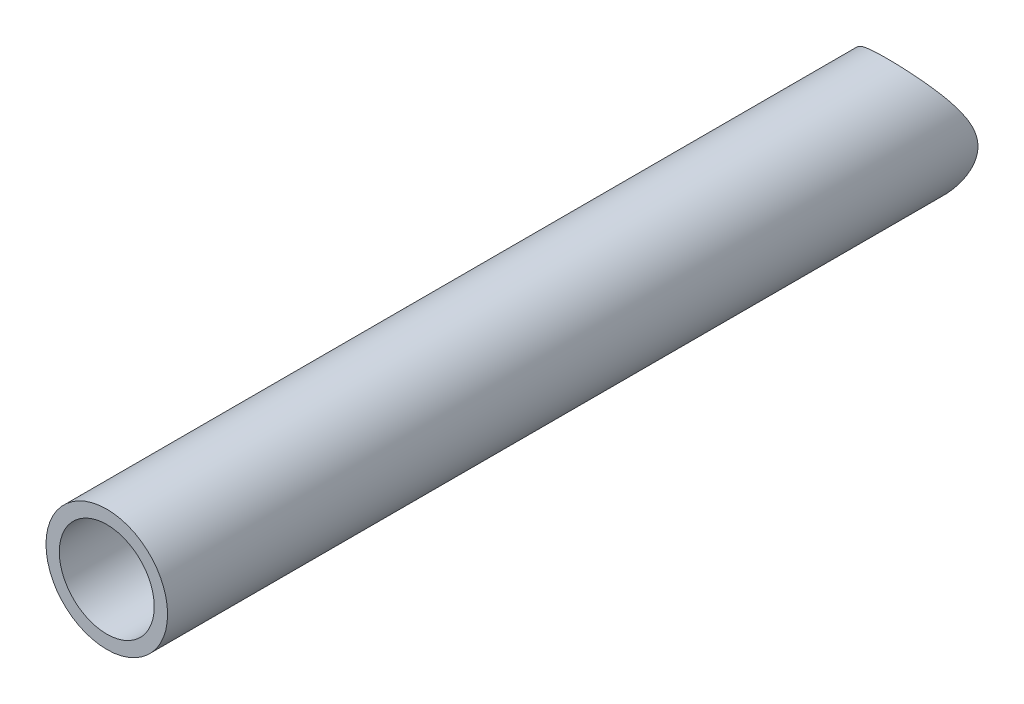
ISO-10303-21;
HEADER;
FILE_DESCRIPTION(('STEP AP214'),'2;1');
FILE_NAME('part.step','',(''),(''),'','','');
FILE_SCHEMA(('AUTOMOTIVE_DESIGN { 1 0 10303 214 1 1 1 1 }'));
ENDSEC;
DATA;
#1=APPLICATION_CONTEXT('core data for automotive mechanical design processes');
#2=APPLICATION_PROTOCOL_DEFINITION('international standard','automotive_design',2000,#1);
#3=PRODUCT_CONTEXT('',#1,'mechanical');
#4=PRODUCT('Part','Part','',(#3));
#5=PRODUCT_RELATED_PRODUCT_CATEGORY('part','',(#4));
#6=PRODUCT_DEFINITION_FORMATION('','',#4);
#7=PRODUCT_DEFINITION_CONTEXT('part definition',#1,'design');
#8=PRODUCT_DEFINITION('design','',#6,#7);
#9=PRODUCT_DEFINITION_SHAPE('','',#8);
#10=(LENGTH_UNIT() NAMED_UNIT(*) SI_UNIT(.MILLI.,.METRE.));
#11=(NAMED_UNIT(*) PLANE_ANGLE_UNIT() SI_UNIT($,.RADIAN.));
#12=(NAMED_UNIT(*) SI_UNIT($,.STERADIAN.) SOLID_ANGLE_UNIT());
#13=UNCERTAINTY_MEASURE_WITH_UNIT(LENGTH_MEASURE(1.E-05),#10,'distance_accuracy_value','');
#14=(GEOMETRIC_REPRESENTATION_CONTEXT(3) GLOBAL_UNCERTAINTY_ASSIGNED_CONTEXT((#13)) GLOBAL_UNIT_ASSIGNED_CONTEXT((#10,
#11,#12)) REPRESENTATION_CONTEXT('',''));
#15=CARTESIAN_POINT('',(0.,0.,0.));
#16=DIRECTION('',(0.,0.,1.));
#17=DIRECTION('',(1.,0.,0.));
#18=AXIS2_PLACEMENT_3D('',#15,#16,#17);
#19=CARTESIAN_POINT('',(0.,0.,177.8));
#20=DIRECTION('',(0.,0.,1.));
#21=DIRECTION('',(1.,0.,0.));
#22=AXIS2_PLACEMENT_3D('',#19,#20,#21);
#23=PLANE('',#22);
#24=CARTESIAN_POINT('',(0.,0.,177.8));
#25=DIRECTION('',(0.,0.,1.));
#26=DIRECTION('',(1.,0.,0.));
#27=AXIS2_PLACEMENT_3D('',#24,#25,#26);
#28=CIRCLE('',#27,13.335);
#29=CARTESIAN_POINT('',(13.335,0.,177.8));
#30=VERTEX_POINT('',#29);
#31=EDGE_CURVE('E10',#30,#30,#28,.T.);
#32=ORIENTED_EDGE('',*,*,#31,.T.);
#33=EDGE_LOOP('',(#32));
#34=FACE_BOUND('',#33,.T.);
#35=CARTESIAN_POINT('',(0.,0.,177.8));
#36=DIRECTION('',(0.,0.,1.));
#37=DIRECTION('',(1.,0.,0.));
#38=AXIS2_PLACEMENT_3D('',#35,#36,#37);
#39=CIRCLE('',#38,10.414);
#40=CARTESIAN_POINT('',(10.414,0.,177.8));
#41=VERTEX_POINT('',#40);
#42=EDGE_CURVE('E43',#41,#41,#39,.T.);
#43=ORIENTED_EDGE('',*,*,#42,.F.);
#44=EDGE_LOOP('',(#43));
#45=FACE_BOUND('',#44,.T.);
#46=ADVANCED_FACE('F30',(#34,#45),#23,.T.);
#47=CARTESIAN_POINT('',(0.,0.,177.8));
#48=DIRECTION('',(0.,0.,-1.));
#49=DIRECTION('',(-1.,0.,0.));
#50=AXIS2_PLACEMENT_3D('',#47,#48,#49);
#51=CYLINDRICAL_SURFACE('',#50,13.335);
#52=ORIENTED_EDGE('',*,*,#31,.F.);
#53=EDGE_LOOP('',(#52));
#54=FACE_BOUND('',#53,.T.);
#55=CARTESIAN_POINT('',(-13.335,0.,0.));
#56=CARTESIAN_POINT('',(-13.3350018835583,-0.25260066554457,-4.41804586379893E-06));
#57=CARTESIAN_POINT('',(-13.3278081915065,-0.505180181138942,0.00946030255961878));
#58=CARTESIAN_POINT('',(-13.2992229696508,-1.0081312686111,0.0468173328208232));
#59=CARTESIAN_POINT('',(-13.2778324639304,-1.25850299842705,0.0747083133022277));
#60=CARTESIAN_POINT('',(-13.221298692822,-1.7556217914152,0.147639503982388));
#61=CARTESIAN_POINT('',(-13.1861289902354,-2.00236093508548,0.19271267595338));
#62=CARTESIAN_POINT('',(-13.1027363122342,-2.49035106736416,0.29806384539933));
#63=CARTESIAN_POINT('',(-13.0545089948928,-2.73160020145244,0.358346900019491));
#64=CARTESIAN_POINT('',(-12.9270679911359,-3.28949608225185,0.514873605096694));
#65=CARTESIAN_POINT('',(-12.8429017011591,-3.60354441668755,0.616354851587238));
#66=CARTESIAN_POINT('',(-12.6541392757462,-4.21884661840762,0.837409574619791));
#67=CARTESIAN_POINT('',(-12.5495350638498,-4.52009537019378,0.956990199275824));
#68=CARTESIAN_POINT('',(-12.3210588362959,-5.11019328667382,1.20971117557399));
#69=CARTESIAN_POINT('',(-12.1971412271413,-5.39901099162804,1.342883349452));
#70=CARTESIAN_POINT('',(-11.9312789951177,-5.96356959471666,1.61844049966321));
#71=CARTESIAN_POINT('',(-11.7893345617438,-6.23931063026906,1.76082537914623));
#72=CARTESIAN_POINT('',(-11.4351207725684,-6.87272159117594,2.10250790305589));
#73=CARTESIAN_POINT('',(-11.2156753742223,-7.22509978127038,2.30421018645036));
#74=CARTESIAN_POINT('',(-10.7460969667935,-7.90663692246017,2.71129416339928));
#75=CARTESIAN_POINT('',(-10.4959533036399,-8.23578774954224,2.91667711311893));
#76=CARTESIAN_POINT('',(-9.96572044979838,-8.87002434324639,3.32515689427277));
#77=CARTESIAN_POINT('',(-9.68565507714535,-9.17512891968713,3.52825540388115));
#78=CARTESIAN_POINT('',(-9.09577027280359,-9.76020740897136,3.92714798984174));
#79=CARTESIAN_POINT('',(-8.78596061093941,-10.040189515495,4.12294443549393));
#80=CARTESIAN_POINT('',(-8.20039149380346,-10.520926265363,4.46532056306));
#81=CARTESIAN_POINT('',(-7.92980709197362,-10.72647206204,4.6140415996008));
#82=CARTESIAN_POINT('',(-7.37001371027608,-11.1185361419878,4.90112213816946));
#83=CARTESIAN_POINT('',(-7.08080832046564,-11.3050580751761,5.03948362642021));
#84=CARTESIAN_POINT('',(-6.48476961243444,-11.6571716843423,5.30318479537009));
#85=CARTESIAN_POINT('',(-6.17795764056499,-11.8227879579729,5.42853974807019));
#86=CARTESIAN_POINT('',(-5.54749851430927,-12.1313886711944,5.66388132694842));
#87=CARTESIAN_POINT('',(-5.22385412946151,-12.2743768183737,5.77387047044705));
#88=CARTESIAN_POINT('',(-4.61445090959261,-12.5147316414834,5.95982470157496));
#89=CARTESIAN_POINT('',(-4.33092557923486,-12.6157372327183,6.03841773704634));
#90=CARTESIAN_POINT('',(-3.75450020312213,-12.7991164936384,6.18164972083977));
#91=CARTESIAN_POINT('',(-3.46160194088284,-12.8814936842211,6.24629130597758));
#92=CARTESIAN_POINT('',(-2.8681404682298,-13.0264831008333,6.36038008423909));
#93=CARTESIAN_POINT('',(-2.56757984496393,-13.0891019050808,6.40983233424702));
#94=CARTESIAN_POINT('',(-1.96066623508877,-13.1936659750032,6.49255852086304));
#95=CARTESIAN_POINT('',(-1.65431317902439,-13.2356109926223,6.52583226335217));
#96=CARTESIAN_POINT('',(-1.03701109149953,-13.2982480320635,6.57556317857216));
#97=CARTESIAN_POINT('',(-0.726049933065985,-13.3188669472207,6.59196250419741));
#98=CARTESIAN_POINT('',(-0.103012729995218,-13.3382438320951,6.60737317878809));
#99=CARTESIAN_POINT('',(0.20906331675464,-13.3370017603655,6.60638449478701));
#100=CARTESIAN_POINT('',(0.831829713082657,-13.3126781946912,6.58704165766493));
#101=CARTESIAN_POINT('',(1.14252000409395,-13.2895957863225,6.56868677744582));
#102=CARTESIAN_POINT('',(1.76006249178827,-13.2219849823655,6.51502345446557));
#103=CARTESIAN_POINT('',(2.06691477164878,-13.1774570523742,6.47971537976998));
#104=CARTESIAN_POINT('',(2.65841816324259,-13.0705979998941,6.39521902122709));
#105=CARTESIAN_POINT('',(2.94338375434867,-13.00933603674,6.34686596880888));
#106=CARTESIAN_POINT('',(3.50619215178327,-12.8690694518321,6.2365415220651));
#107=CARTESIAN_POINT('',(3.78403526873392,-12.790065605301,6.17457072276271));
#108=CARTESIAN_POINT('',(4.33119902282741,-12.6152856498986,6.03807517426191));
#109=CARTESIAN_POINT('',(4.60051988272296,-12.5195099798334,5.96355075350951));
#110=CARTESIAN_POINT('',(5.1296149373469,-12.3121910574254,5.80309969459564));
#111=CARTESIAN_POINT('',(5.38938559652075,-12.2006420382811,5.71716888691923));
#112=CARTESIAN_POINT('',(5.92314694256134,-11.9512989152239,5.52632735738705));
#113=CARTESIAN_POINT('',(6.19606858852893,-11.8120080699776,5.42038383999724));
#114=CARTESIAN_POINT('',(6.72852987068944,-11.5170222291997,5.19793817635211));
#115=CARTESIAN_POINT('',(6.98806390677509,-11.3613204504507,5.08143166684332));
#116=CARTESIAN_POINT('',(7.49313237236962,-11.0347473814483,4.83956293860301));
#117=CARTESIAN_POINT('',(7.73866414659993,-10.8638732296312,4.71419905025285));
#118=CARTESIAN_POINT('',(8.21534781549371,-10.5080336183393,4.45630653732362));
#119=CARTESIAN_POINT('',(8.44649777709958,-10.323066272001,4.32377695405953));
#120=CARTESIAN_POINT('',(8.94021319861167,-9.90055490386111,4.02542206890903));
#121=CARTESIAN_POINT('',(9.19947085220181,-9.66001839293889,3.85835197711781));
#122=CARTESIAN_POINT('',(9.69655392584509,-9.16095787290498,3.51921059201487));
#123=CARTESIAN_POINT('',(9.93437574758541,-8.90243085668733,3.3471384654273));
#124=CARTESIAN_POINT('',(10.3886301428753,-8.36790011144193,3.00094897274981));
#125=CARTESIAN_POINT('',(10.6050386411018,-8.09187727076411,2.82682954540126));
#126=CARTESIAN_POINT('',(11.0158726269487,-7.52302253492355,2.48019420728758));
#127=CARTESIAN_POINT('',(11.2103009334064,-7.23019280242983,2.30767809351672));
#128=CARTESIAN_POINT('',(11.5568219625657,-6.66039677944759,1.98662223375441));
#129=CARTESIAN_POINT('',(11.711219227524,-6.38515354902388,1.83751110216693));
#130=CARTESIAN_POINT('',(12.0015773776697,-5.82108162671999,1.54703115296451));
#131=CARTESIAN_POINT('',(12.1375364225574,-5.53225158262329,1.4056631090173));
#132=CARTESIAN_POINT('',(12.3898436719785,-4.94135935041646,1.13493601954768));
#133=CARTESIAN_POINT('',(12.5062253613423,-4.63932089232399,1.00555664263072));
#134=CARTESIAN_POINT('',(12.7182990683145,-4.02164137432731,0.763361027408029));
#135=CARTESIAN_POINT('',(12.8140000744825,-3.70600629582986,0.650537600169346));
#136=CARTESIAN_POINT('',(12.9583480552744,-3.15580069992221,0.476663121517532));
#137=CARTESIAN_POINT('',(13.012578702554,-2.92442771123945,0.410108320642635));
#138=CARTESIAN_POINT('',(13.1090843688346,-2.45587138888756,0.29017335867426));
#139=CARTESIAN_POINT('',(13.1513631892406,-2.2186899288039,0.236789009268395));
#140=CARTESIAN_POINT('',(13.2232141598878,-1.73991713503723,0.145244287195908));
#141=CARTESIAN_POINT('',(13.252808545442,-1.49833429848433,0.107057282656748));
#142=CARTESIAN_POINT('',(13.2988000197528,-1.01184151245427,0.0474115283567748));
#143=CARTESIAN_POINT('',(13.3151973674002,-0.766931628340788,0.0259524504387124));
#144=CARTESIAN_POINT('',(13.3344677036844,-0.274343177246851,0.000711560174502452));
#145=CARTESIAN_POINT('',(13.3372680199915,-0.0266568094237172,-0.00297526368958773));
#146=CARTESIAN_POINT('',(13.3290786147271,0.468083085198075,0.00776978841826561));
#147=CARTESIAN_POINT('',(13.3180890659849,0.715136619889184,0.0222014373102772));
#148=CARTESIAN_POINT('',(13.282562242767,1.20690658021464,0.0685050160871282));
#149=CARTESIAN_POINT('',(13.2580082663322,1.45161974547984,0.100398446332441));
#150=CARTESIAN_POINT('',(13.1958756748349,1.9367315407125,0.180189296193889));
#151=CARTESIAN_POINT('',(13.1582950654663,2.17712950411564,0.228089166267897));
#152=CARTESIAN_POINT('',(13.0591373744708,2.71564739922316,0.352622006032737));
#153=CARTESIAN_POINT('',(12.9938354987734,3.01209796460511,0.433509414504391));
#154=CARTESIAN_POINT('',(12.8449013345005,3.59460915157597,0.613621970225148));
#155=CARTESIAN_POINT('',(12.7612631741685,3.88066641067301,0.71285298997702));
#156=CARTESIAN_POINT('',(12.5767550227727,4.44241801714673,0.925774852731412));
#157=CARTESIAN_POINT('',(12.4758438543641,4.71808563465355,1.03950007923341));
#158=CARTESIAN_POINT('',(12.2579879680555,5.25820943829558,1.27755406497322));
#159=CARTESIAN_POINT('',(12.1410425865128,5.52266515978627,1.40188326302007));
#160=CARTESIAN_POINT('',(11.8371583681547,6.15426722584639,1.71426733541413));
#161=CARTESIAN_POINT('',(11.6420342936373,6.51551250633955,1.90633129338224));
#162=CARTESIAN_POINT('',(11.2216175238868,7.21555903342094,2.29831092727666));
#163=CARTESIAN_POINT('',(10.9963130172986,7.55435141489833,2.49822965547306));
#164=CARTESIAN_POINT('',(10.5161025857764,8.20968598018093,2.899943197658));
#165=CARTESIAN_POINT('',(10.2611691765466,8.52620706078353,3.10173959121546));
#166=CARTESIAN_POINT('',(9.7222955130326,9.13590037329923,3.50173354755338));
#167=CARTESIAN_POINT('',(9.43835963850486,9.42907611880254,3.69993164841534));
#168=CARTESIAN_POINT('',(8.83810553010333,9.99409933574634,4.09033115020463));
#169=CARTESIAN_POINT('',(8.52143787305497,10.2656467378906,4.28243132467427));
#170=CARTESIAN_POINT('',(7.85900952004657,10.7812020330972,4.65334785506308));
#171=CARTESIAN_POINT('',(7.51324438693058,11.0252057126083,4.83216217712854));
#172=CARTESIAN_POINT('',(6.79461941113272,11.4819916908848,5.17122972886973));
#173=CARTESIAN_POINT('',(6.42183720734669,11.6948585322159,5.33153296048587));
#174=CARTESIAN_POINT('',(5.65023186357861,12.0865217604438,5.62931182776178));
#175=CARTESIAN_POINT('',(5.25142377307236,12.2653376070083,5.76680049581335));
#176=CARTESIAN_POINT('',(4.56361981988235,12.5333321327887,5.97427554007837));
#177=CARTESIAN_POINT('',(4.28082741167634,12.6327964408013,6.0517116325857));
#178=CARTESIAN_POINT('',(3.70604602932891,12.8132003498665,6.19268656788534));
#179=CARTESIAN_POINT('',(3.41405946034836,12.8941447506088,6.25622901121905));
#180=CARTESIAN_POINT('',(2.82265090056091,13.0363844364874,6.3681912754996));
#181=CARTESIAN_POINT('',(2.52323293693166,13.0976901239936,6.41661910211107));
#182=CARTESIAN_POINT('',(1.91875291464487,13.1997938182709,6.49741564174296));
#183=CARTESIAN_POINT('',(1.61369064863518,13.2405910700757,6.52978376356547));
#184=CARTESIAN_POINT('',(0.999118934738675,13.3011143598618,6.57784171979375));
#185=CARTESIAN_POINT('',(0.689597930404728,13.3207686203741,6.5934747400228));
#186=CARTESIAN_POINT('',(0.0695466855144508,13.3384249055402,6.60751740280568));
#187=CARTESIAN_POINT('',(-0.240983550759719,13.3364270219441,6.60592711834266));
#188=CARTESIAN_POINT('',(-0.860608230919038,13.3108129018294,6.5855586762831));
#189=CARTESIAN_POINT('',(-1.16970253629438,13.2871946216086,6.56677889382204));
#190=CARTESIAN_POINT('',(-1.7840271077989,13.2187364352257,6.5124472851639));
#191=CARTESIAN_POINT('',(-2.08925744028245,13.1738968939962,6.47689574738329));
#192=CARTESIAN_POINT('',(-2.67904189008748,13.0663858685518,6.39189296811723));
#193=CARTESIAN_POINT('',(-2.96388256264536,13.0046803663957,6.34319609327019));
#194=CARTESIAN_POINT('',(-3.52640331101175,12.8635451096217,6.23220507066962));
#195=CARTESIAN_POINT('',(-3.80408367326884,12.7841160652659,6.16991146780043));
#196=CARTESIAN_POINT('',(-4.35089076211127,12.6085067209682,6.03279501658021));
#197=CARTESIAN_POINT('',(-4.62001768351707,12.5123268028823,5.95797245384311));
#198=CARTESIAN_POINT('',(-5.14869868236347,12.3042217198989,5.79695239296523));
#199=CARTESIAN_POINT('',(-5.40824921556641,12.192290797864,5.71075073637734));
#200=CARTESIAN_POINT('',(-5.94175442813972,11.9420638650091,5.51929005874799));
#201=CARTESIAN_POINT('',(-6.21462772166141,11.8022590274366,5.41299128076769));
#202=CARTESIAN_POINT('',(-6.74695181375943,11.506244913808,5.18985498746836));
#203=CARTESIAN_POINT('',(-7.0063969932695,11.3500288519171,5.07301311555204));
#204=CARTESIAN_POINT('',(-7.51130379608293,11.0223930959822,4.83047292757707));
#205=CARTESIAN_POINT('',(-7.75675983457645,10.8509673987442,4.70477111859027));
#206=CARTESIAN_POINT('',(-8.23316407807805,10.4940843291692,4.44627719970785));
#207=CARTESIAN_POINT('',(-8.46411572507522,10.3086303090509,4.31348678592874));
#208=CARTESIAN_POINT('',(-8.95751360458415,9.88491893846115,4.01450568628332));
#209=CARTESIAN_POINT('',(-9.2166344407091,9.64365871090713,3.84707386405982));
#210=CARTESIAN_POINT('',(-9.71338359433793,9.1431269962013,3.50726566085311));
#211=CARTESIAN_POINT('',(-9.95100833717147,8.8838525260181,3.33488846373858));
#212=CARTESIAN_POINT('',(-10.4047731239597,8.34783518111774,2.98818826749895));
#213=CARTESIAN_POINT('',(-10.6208922881973,8.0710757482913,2.81386355666099));
#214=CARTESIAN_POINT('',(-11.0310894425851,7.50071243200201,2.46691288223526));
#215=CARTESIAN_POINT('',(-11.2251700784236,7.20711057682673,2.29428671701727));
#216=CARTESIAN_POINT('',(-11.5701538277917,6.6371554354444,1.9738984726655));
#217=CARTESIAN_POINT('',(-11.7234578570591,6.36259678810151,1.82552949638663));
#218=CARTESIAN_POINT('',(-12.0117396857837,5.80002207497551,1.5365813204646));
#219=CARTESIAN_POINT('',(-12.1467165367624,5.51200531373641,1.39600252420598));
#220=CARTESIAN_POINT('',(-12.3973007546463,4.92255818333212,1.12673210327336));
#221=CARTESIAN_POINT('',(-12.5129267955052,4.62114110554173,0.998029072682754));
#222=CARTESIAN_POINT('',(-12.6708961648661,4.15897860022359,0.817428352816471));
#223=CARTESIAN_POINT('',(-12.720970424832,4.00326647621674,0.759308548188348));
#224=CARTESIAN_POINT('',(-12.8157902265065,3.68846645240004,0.64785471245141));
#225=CARTESIAN_POINT('',(-12.8605337488949,3.52937730006469,0.594522496788288));
#226=CARTESIAN_POINT('',(-12.9723189437138,3.10121593117371,0.459767701675861));
#227=CARTESIAN_POINT('',(-13.0344342958884,2.82927051577926,0.383212897052135));
#228=CARTESIAN_POINT('',(-13.1420471176317,2.2776581941,0.248759025540197));
#229=CARTESIAN_POINT('',(-13.1875516194773,1.99799460939796,0.190852065230886));
#230=CARTESIAN_POINT('',(-13.2607666824456,1.43352982580562,0.0968812511782515));
#231=CARTESIAN_POINT('',(-13.2885301289126,1.14874652291903,0.0607524959376859));
#232=CARTESIAN_POINT('',(-13.3256440457461,0.575965922965784,0.012316547011447));
#233=CARTESIAN_POINT('',(-13.3349978527103,0.287969217819625,5.03665027543216E-06));
#234=CARTESIAN_POINT('',(-13.335,0.,0.));
#235=B_SPLINE_CURVE_WITH_KNOTS('',3,(#55,#56,#57,#58,#59,#60,#61,#62,#63,#64,#65,#66,#67,#68,
#69,#70,#71,#72,#73,#74,#75,#76,#77,#78,#79,#80,#81,#82,#83,#84,#85,#86,#87,#88,#89,#90,#91,#92,
#93,#94,#95,#96,#97,#98,#99,#100,#101,#102,#103,#104,#105,#106,#107,#108,#109,#110,#111,#112,
#113,#114,#115,#116,#117,#118,#119,#120,#121,#122,#123,#124,#125,#126,#127,#128,#129,#130,#131,
#132,#133,#134,#135,#136,#137,#138,#139,#140,#141,#142,#143,#144,#145,#146,#147,#148,#149,#150,
#151,#152,#153,#154,#155,#156,#157,#158,#159,#160,#161,#162,#163,#164,#165,#166,#167,#168,#169,
#170,#171,#172,#173,#174,#175,#176,#177,#178,#179,#180,#181,#182,#183,#184,#185,#186,#187,#188,
#189,#190,#191,#192,#193,#194,#195,#196,#197,#198,#199,#200,#201,#202,#203,#204,#205,#206,#207,
#208,#209,#210,#211,#212,#213,#214,#215,#216,#217,#218,#219,#220,#221,#222,#223,#224,#225,#226,
#227,#228,#229,#230,#231,#232,#233,#234),.UNSPECIFIED.,.T.,.F.,(4,2,2,2,2,2,2,2,2,2,2,2,2,2,2,2,
2,2,2,2,2,2,2,2,2,2,2,2,2,2,2,2,2,2,2,2,2,2,2,2,2,2,2,2,2,2,2,2,2,2,2,2,2,2,2,2,2,2,2,2,2,2,2,2,
2,2,2,2,2,2,2,2,2,2,2,2,2,2,2,2,2,2,2,2,2,2,2,2,2,4),(0.,0.757492603462582,1.51493057132342,
2.27382895662258,3.03298000189446,4.05316777887395,5.07375952216547,6.09679814521146,
7.11982601513092,8.50264292621323,9.885941119088,11.2681462805546,12.6498989853766,
13.7616640148444,14.8732153382742,15.9834463691097,17.0934953013038,18.0257692725457,
18.9578668899685,19.8896538531386,20.8214519961445,21.7564338958387,22.6914175681967,
23.6264403887329,24.5614429101957,25.4468690785033,26.3322565660819,27.2176208924678,
28.1033097526712,29.0750132113793,30.0471198962682,31.0194103149822,31.991831138059,
33.1641176298033,34.336600541633,35.5103870619888,36.6840228795758,37.7303936076991,
38.776868696255,39.8215352970923,40.865746931387,41.605493547816,42.3450046145968,
43.0832139925408,43.8214088884236,44.5635449191221,45.3056716486769,46.0487142065181,
46.7918705703841,47.7328527048514,48.6741366076111,49.6176965229466,50.5612955032405,
51.9192515459655,53.2777405969196,54.637500018396,55.9970544009157,57.3730150509172,
58.7491859065692,60.1215479222455,61.4931232828782,62.4210722567217,63.3487804666688,
64.2759964660231,65.2032465959866,66.1336347703177,67.0640190021624,67.9944911891327,
68.9249473757657,69.810458603537,70.6959343512543,71.5813899161473,72.4671699679362,
73.4397629947177,74.4127597712546,75.386142309596,76.3592929780608,77.533105424131,
78.7071127106593,79.8822489389209,81.0572439445793,82.0995908142991,83.1419916076063,
84.1833805872736,84.7039788284557,85.2247736530082,86.0914471044991,86.9577532192615,
87.8214647141655,88.6850196539476),.UNSPECIFIED.);
#236=CARTESIAN_POINT('',(-13.335,0.,0.));
#237=VERTEX_POINT('',#236);
#238=EDGE_CURVE('E47',#237,#237,#235,.T.);
#239=ORIENTED_EDGE('',*,*,#238,.T.);
#240=EDGE_LOOP('',(#239));
#241=FACE_BOUND('',#240,.T.);
#242=ADVANCED_FACE('F32',(#54,#241),#51,.T.);
#243=CARTESIAN_POINT('',(0.,0.,177.8));
#244=DIRECTION('',(0.,0.,-1.));
#245=DIRECTION('',(-1.,0.,0.));
#246=AXIS2_PLACEMENT_3D('',#243,#244,#245);
#247=CYLINDRICAL_SURFACE('',#246,10.414);
#248=CARTESIAN_POINT('',(-10.414,0.,2.97777593064981));
#249=CARTESIAN_POINT('',(-10.4139971977502,-0.259320293602472,2.9777803668923));
#250=CARTESIAN_POINT('',(-10.4042945538137,-0.51869902090619,2.98548779044861));
#251=CARTESIAN_POINT('',(-10.3656562718614,-1.03524009341079,3.01597679964009));
#252=CARTESIAN_POINT('',(-10.3367088612837,-1.29240098429833,3.03876761216765));
#253=CARTESIAN_POINT('',(-10.260024735684,-1.80278066142993,3.09846866802453));
#254=CARTESIAN_POINT('',(-10.2122489044345,-2.0559900926193,3.13540830114828));
#255=CARTESIAN_POINT('',(-10.0986605107374,-2.5562265947107,3.22189373605026));
#256=CARTESIAN_POINT('',(-10.0328389857492,-2.80325052682713,3.27144580101731));
#257=CARTESIAN_POINT('',(-9.8847359146255,-3.28738159226009,3.38081092660631));
#258=CARTESIAN_POINT('',(-9.80261014376922,-3.52455867743518,3.44052616838954));
#259=CARTESIAN_POINT('',(-9.62240226983704,-3.99039154173782,3.56862397722607));
#260=CARTESIAN_POINT('',(-9.52431284944504,-4.21904335374996,3.63701051578294));
#261=CARTESIAN_POINT('',(-9.20738904817267,-4.89083655452697,3.85224108364626));
#262=CARTESIAN_POINT('',(-8.96575135909287,-5.32029169454097,4.00927032877828));
#263=CARTESIAN_POINT('',(-8.54444360879435,-5.95992815410918,4.26494294173709));
#264=CARTESIAN_POINT('',(-8.38331597477739,-6.18446434176115,4.35938925070721));
#265=CARTESIAN_POINT('',(-8.04407691078616,-6.61968916255632,4.55005397967297));
#266=CARTESIAN_POINT('',(-7.86596288317263,-6.83037566939231,4.64627266888823));
#267=CARTESIAN_POINT('',(-7.49330876126374,-7.23725947910777,4.83832746942558));
#268=CARTESIAN_POINT('',(-7.29875310803802,-7.43344272072321,4.93416312641745));
#269=CARTESIAN_POINT('',(-6.89406041312966,-7.81023230757363,5.12325081709631));
#270=CARTESIAN_POINT('',(-6.68392853691619,-7.99084377420345,5.21650369333136));
#271=CARTESIAN_POINT('',(-6.22275249029921,-8.35615166972902,5.40931036463223));
#272=CARTESIAN_POINT('',(-5.96981644115937,-8.53877227472691,5.50829165987568));
#273=CARTESIAN_POINT('',(-5.44630261631851,-8.88184222832684,5.69787376870146));
#274=CARTESIAN_POINT('',(-5.17572308548167,-9.04228936619227,5.7884737463533));
#275=CARTESIAN_POINT('',(-4.61861189959138,-9.33913022885647,5.95863714321561));
#276=CARTESIAN_POINT('',(-4.33209228020508,-9.47554178607931,6.03820873514754));
#277=CARTESIAN_POINT('',(-3.74487915977016,-9.72258615327123,6.18395836041019));
#278=CARTESIAN_POINT('',(-3.44418820912209,-9.83322358064619,6.25013879247226));
#279=CARTESIAN_POINT('',(-2.86200239050502,-10.0171816692424,6.36106652563247));
#280=CARTESIAN_POINT('',(-2.58162283487851,-10.0931379217884,6.40730088505703));
#281=CARTESIAN_POINT('',(-2.01362335144057,-10.2216177127417,6.48588851263788));
#282=CARTESIAN_POINT('',(-1.72600386656626,-10.2741426810062,6.51824262780958));
#283=CARTESIAN_POINT('',(-1.14634228435869,-10.3548469124762,6.56808129969772));
#284=CARTESIAN_POINT('',(-0.85430421821056,-10.3830471481908,6.58557866553131));
#285=CARTESIAN_POINT('',(-0.26838673135028,-10.4146726556277,6.60520687315526));
#286=CARTESIAN_POINT('',(0.0254924775728095,-10.4181007263917,6.60733945103438));
#287=CARTESIAN_POINT('',(0.573180741696013,-10.4013296747898,6.59692515477913));
#288=CARTESIAN_POINT('',(0.827127734053408,-10.3842081291406,6.58629031477561));
#289=CARTESIAN_POINT('',(1.33234400132038,-10.3315410928264,6.5536813359588));
#290=CARTESIAN_POINT('',(1.58361357008771,-10.295997645743,6.53170845490028));
#291=CARTESIAN_POINT('',(2.08174410072439,-10.2069469513966,6.4769242380585));
#292=CARTESIAN_POINT('',(2.3286048874304,-10.1534389920584,6.44411247264566));
#293=CARTESIAN_POINT('',(2.81633671800717,-10.0291069295344,6.36837244934931));
#294=CARTESIAN_POINT('',(3.05720750992504,-9.95828209931407,6.32544376671812));
#295=CARTESIAN_POINT('',(3.53223394396005,-9.79987686986047,6.23023763570334));
#296=CARTESIAN_POINT('',(3.76636891025412,-9.71225014077949,6.1779343643066));
#297=CARTESIAN_POINT('',(4.22613044874113,-9.52119827621875,6.06508341829123));
#298=CARTESIAN_POINT('',(4.45175396897102,-9.41776753976283,6.00453282163117));
#299=CARTESIAN_POINT('',(4.89339785099951,-9.19603705440096,5.87635475591259));
#300=CARTESIAN_POINT('',(5.10942034608744,-9.07774063114501,5.80872887025423));
#301=CARTESIAN_POINT('',(5.53121272805852,-8.82707748564328,5.6675707017009));
#302=CARTESIAN_POINT('',(5.73697890568146,-8.69470572642178,5.59403630671263));
#303=CARTESIAN_POINT('',(6.16231924893595,-8.39953876766275,5.43295260313469));
#304=CARTESIAN_POINT('',(6.38045785527995,-8.23500539125246,5.34479429230737));
#305=CARTESIAN_POINT('',(6.80218061979963,-7.89024272583301,5.1644566070092));
#306=CARTESIAN_POINT('',(7.00576371058284,-7.71001228786425,5.07227693843857));
#307=CARTESIAN_POINT('',(7.39800569628902,-7.33448873435175,4.88567452267107));
#308=CARTESIAN_POINT('',(7.58664400401544,-7.13917554814316,4.79124890648963));
#309=CARTESIAN_POINT('',(7.94808482183726,-6.73446075630917,4.60227202089178));
#310=CARTESIAN_POINT('',(8.12088664069449,-6.52505853641047,4.50772074617314));
#311=CARTESIAN_POINT('',(8.47117003607218,-6.06503510054474,4.30857167898344));
#312=CARTESIAN_POINT('',(8.64639955182706,-5.81257496529841,4.2042441857937));
#313=CARTESIAN_POINT('',(8.97481240416957,-5.29140959896376,4.00136260944723));
#314=CARTESIAN_POINT('',(9.1279916771673,-5.02270138647747,3.90280959243507));
#315=CARTESIAN_POINT('',(9.41074314872855,-4.47050119638304,3.7151717078068));
#316=CARTESIAN_POINT('',(9.54035053145641,-4.18703207863767,3.6260728128713));
#317=CARTESIAN_POINT('',(9.77463853439706,-3.60634853960709,3.4609518258683));
#318=CARTESIAN_POINT('',(9.87932967400567,-3.30913998249792,3.38492421900691));
#319=CARTESIAN_POINT('',(10.0382478767089,-2.7820410123251,3.2673469032732));
#320=CARTESIAN_POINT('',(10.0985152628602,-2.55480848868063,3.2219764616516));
#321=CARTESIAN_POINT('',(10.2038162510079,-2.09502152073701,3.14185461773527));
#322=CARTESIAN_POINT('',(10.2488535003903,-1.86246836491193,3.10710067314404));
#323=CARTESIAN_POINT('',(10.3230524859214,-1.39364406639401,3.04944615367134));
#324=CARTESIAN_POINT('',(10.3522316870791,-1.15737731001042,3.02653254000399));
#325=CARTESIAN_POINT('',(10.3943447467208,-0.68250047841751,2.99336078186224));
#326=CARTESIAN_POINT('',(10.4072783330498,-0.443890364018498,2.98310284940253));
#327=CARTESIAN_POINT('',(10.4166953754005,0.0343744934949076,2.97564024739009));
#328=CARTESIAN_POINT('',(10.4131434260518,0.274030379560336,2.9784636721579));
#329=CARTESIAN_POINT('',(10.3895682601491,0.752015672463478,2.99711503847896));
#330=CARTESIAN_POINT('',(10.369544949742,0.990345071735152,3.01294305413168));
#331=CARTESIAN_POINT('',(10.3133308867632,1.46408585433058,3.05700237873899));
#332=CARTESIAN_POINT('',(10.2771286970399,1.69949505210409,3.08524246178182));
#333=CARTESIAN_POINT('',(10.189085958223,2.16568821461459,3.15309267390486));
#334=CARTESIAN_POINT('',(10.1372450132863,2.39647206211849,3.19270309078612));
#335=CARTESIAN_POINT('',(10.0194377882424,2.84888145409226,3.28132601508104));
#336=CARTESIAN_POINT('',(9.95368440389312,3.07059081879295,3.33019576847848));
#337=CARTESIAN_POINT('',(9.80828404873303,3.50741700181085,3.43628401927867));
#338=CARTESIAN_POINT('',(9.72863252694356,3.72253163345523,3.49350525038607));
#339=CARTESIAN_POINT('',(9.55611189038958,4.14539164773381,3.61481045695557));
#340=CARTESIAN_POINT('',(9.46324214535521,4.35313667838109,3.67889475962581));
#341=CARTESIAN_POINT('',(9.26490163544422,4.76071072688401,3.81246472751376));
#342=CARTESIAN_POINT('',(9.15943030607957,4.9605393895916,3.88195063464763));
#343=CARTESIAN_POINT('',(8.91533635146816,5.38886675075726,4.03844387740767));
#344=CARTESIAN_POINT('',(8.77421617193913,5.61564252564724,4.12628000732022));
#345=CARTESIAN_POINT('',(8.47570350279014,6.05679746000362,4.30538677574593));
#346=CARTESIAN_POINT('',(8.31830913300622,6.27117518264664,4.39665781031858));
#347=CARTESIAN_POINT('',(7.98776657594202,6.68712250733902,4.58064068344264));
#348=CARTESIAN_POINT('',(7.81460409156648,6.88868019841784,4.67335376507873));
#349=CARTESIAN_POINT('',(7.45323767712683,7.27813284217124,4.85818843221776));
#350=CARTESIAN_POINT('',(7.26503282585573,7.46602695672928,4.95030998112095));
#351=CARTESIAN_POINT('',(6.84367018738068,7.85558525050047,5.14628054205958));
#352=CARTESIAN_POINT('',(6.60807736345221,8.05483323229106,5.24972030235172));
#353=CARTESIAN_POINT('',(6.11851929907131,8.43271726472761,5.45057969894014));
#354=CARTESIAN_POINT('',(5.86455533713263,8.61135474749154,5.54799975329621));
#355=CARTESIAN_POINT('',(5.33944167700222,8.94643654070129,5.73417696331794));
#356=CARTESIAN_POINT('',(5.06829606132266,9.10288609479853,5.82293616424248));
#357=CARTESIAN_POINT('',(4.51028290166067,9.39188097750883,5.98928489696684));
#358=CARTESIAN_POINT('',(4.22341738064552,9.52442937254507,6.06687586134868));
#359=CARTESIAN_POINT('',(3.65412905632596,9.75639614314769,6.20414857931613));
#360=CARTESIAN_POINT('',(3.37253211221087,9.85735831068931,6.26464207034485));
#361=CARTESIAN_POINT('',(2.79928054605,10.0352109681353,6.37199840489308));
#362=CARTESIAN_POINT('',(2.5076261847527,10.1121020815855,6.4188616014947));
#363=CARTESIAN_POINT('',(1.91711013662679,10.2404725124521,6.49747423106918));
#364=CARTESIAN_POINT('',(1.61825688509425,10.2919801857666,6.52924052740269));
#365=CARTESIAN_POINT('',(1.01595154190069,10.3687683480231,6.57670536772073));
#366=CARTESIAN_POINT('',(0.712500192707523,10.3940530264282,6.5924064783214));
#367=CARTESIAN_POINT('',(0.148507738382179,10.416189660763,6.60615278760443));
#368=CARTESIAN_POINT('',(-0.11184572012105,10.4166465158498,6.60643652518156));
#369=CARTESIAN_POINT('',(-0.631567863407745,10.3980819293779,6.59490819958499));
#370=CARTESIAN_POINT('',(-0.890936660284737,10.3790627760302,6.5830975573643));
#371=CARTESIAN_POINT('',(-1.406708392498,10.3218167032748,6.54766953458309));
#372=CARTESIAN_POINT('',(-1.6631114399995,10.283590512727,6.52405260204248));
#373=CARTESIAN_POINT('',(-2.17111694577121,10.1884459440091,6.4655741800496));
#374=CARTESIAN_POINT('',(-2.42271929611379,10.1315271461208,6.43071243811009));
#375=CARTESIAN_POINT('',(-2.91149803186152,10.001822706489,6.35182636716105));
#376=CARTESIAN_POINT('',(-3.14887843271999,9.9296027925776,6.30813076648436));
#377=CARTESIAN_POINT('',(-3.61635044641447,9.76905863969296,6.21182554648647));
#378=CARTESIAN_POINT('',(-3.84643949843314,9.68072881469908,6.15921283565658));
#379=CARTESIAN_POINT('',(-4.29807920813265,9.48884079574777,6.04611373419347));
#380=CARTESIAN_POINT('',(-4.51963222697762,9.38528685168137,5.98562954146398));
#381=CARTESIAN_POINT('',(-4.95344234988237,9.16374121113363,5.85785538490811));
#382=CARTESIAN_POINT('',(-5.16569605796869,9.04574429899307,5.79056296401788));
#383=CARTESIAN_POINT('',(-5.60173047577871,8.78312966105695,5.64302972190693));
#384=CARTESIAN_POINT('',(-5.82440314813327,8.63701893294494,5.56217046590182));
#385=CARTESIAN_POINT('',(-6.25672035804296,8.32918390838072,5.39517829946999));
#386=CARTESIAN_POINT('',(-6.46635908864569,8.16745273340481,5.30904307191247));
#387=CARTESIAN_POINT('',(-6.87203171530118,7.82920050437815,5.13313802816352));
#388=CARTESIAN_POINT('',(-7.06805425716082,7.65266737174848,5.04336527518684));
#389=CARTESIAN_POINT('',(-7.44574143092124,7.28571670171304,4.8619963517261));
#390=CARTESIAN_POINT('',(-7.6274050310356,7.09529816843467,4.77040005079882));
#391=CARTESIAN_POINT('',(-8.00054095827985,6.67329944597837,4.57420933099346));
#392=CARTESIAN_POINT('',(-8.18974967723019,6.43971185860251,4.4696140667959));
#393=CARTESIAN_POINT('',(-8.5478542323317,5.95618259764965,4.26329703436769));
#394=CARTESIAN_POINT('',(-8.71674639320838,5.70623797766724,4.16157578858714));
#395=CARTESIAN_POINT('',(-9.03303719774256,5.19104455104552,3.96420215539862));
#396=CARTESIAN_POINT('',(-9.18044943213611,4.92580557102348,3.86854595236404));
#397=CARTESIAN_POINT('',(-9.45267470651288,4.38076570000346,3.68656791760841));
#398=CARTESIAN_POINT('',(-9.57748364742244,4.10096217956874,3.60024778010994));
#399=CARTESIAN_POINT('',(-9.77802028294399,3.59154522704361,3.45819457879663));
#400=CARTESIAN_POINT('',(-9.85849933444617,3.36450331350858,3.39991749103385));
#401=CARTESIAN_POINT('',(-10.0039908272937,2.90343642969362,3.29293195511677));
#402=CARTESIAN_POINT('',(-10.069012744353,2.66941583711998,3.24421764788269));
#403=CARTESIAN_POINT('',(-10.1827280705799,2.19603155514998,3.15803191845286));
#404=CARTESIAN_POINT('',(-10.2314618371334,1.95668266272723,3.12053273302715));
#405=CARTESIAN_POINT('',(-10.3121119844975,1.47364657633527,3.05800481682485));
#406=CARTESIAN_POINT('',(-10.3440373206463,1.22996176418861,3.03296944585898));
#407=CARTESIAN_POINT('',(-10.3828359233204,0.821624441979136,3.0024343333878));
#408=CARTESIAN_POINT('',(-10.3945118178096,0.657686202874291,2.99320502912141));
#409=CARTESIAN_POINT('',(-10.4100956628012,0.329173250568216,2.98087369627422));
#410=CARTESIAN_POINT('',(-10.4140017786723,0.164598396236131,2.97777311483316));
#411=CARTESIAN_POINT('',(-10.414,0.,2.97777593064981));
#412=B_SPLINE_CURVE_WITH_KNOTS('',3,(#248,#249,#250,#251,#252,#253,#254,#255,#256,#257,#258,
#259,#260,#261,#262,#263,#264,#265,#266,#267,#268,#269,#270,#271,#272,#273,#274,#275,#276,#277,
#278,#279,#280,#281,#282,#283,#284,#285,#286,#287,#288,#289,#290,#291,#292,#293,#294,#295,#296,
#297,#298,#299,#300,#301,#302,#303,#304,#305,#306,#307,#308,#309,#310,#311,#312,#313,#314,#315,
#316,#317,#318,#319,#320,#321,#322,#323,#324,#325,#326,#327,#328,#329,#330,#331,#332,#333,#334,
#335,#336,#337,#338,#339,#340,#341,#342,#343,#344,#345,#346,#347,#348,#349,#350,#351,#352,#353,
#354,#355,#356,#357,#358,#359,#360,#361,#362,#363,#364,#365,#366,#367,#368,#369,#370,#371,#372,
#373,#374,#375,#376,#377,#378,#379,#380,#381,#382,#383,#384,#385,#386,#387,#388,#389,#390,#391,
#392,#393,#394,#395,#396,#397,#398,#399,#400,#401,#402,#403,#404,#405,#406,#407,#408,#409,#410,
#411),.UNSPECIFIED.,.T.,.F.,(4,2,2,2,2,2,2,2,2,2,2,2,2,2,2,2,2,2,2,2,2,2,2,2,2,2,2,2,2,2,2,2,2,
2,2,2,2,2,2,2,2,2,2,2,2,2,2,2,2,2,2,2,2,2,2,2,2,2,2,2,2,2,2,2,2,2,2,2,2,2,2,2,2,2,2,2,2,2,2,2,2,
4),(0.,0.777771002943766,1.55601822849256,2.33589086626322,3.11615153799331,3.88928804951653,
4.66277994975899,6.20824467067168,7.08378924121371,7.95946791951104,8.83598474806569,
9.71221219082881,10.6928074033931,11.6735003127295,12.6534625365197,13.6332490659596,
14.5143899428735,15.3954770421968,16.2758037166903,17.1560309202874,17.9193506848063,
18.6825857907194,19.4458511532267,20.2091485663045,20.9745817900272,21.7402869169269,
22.5058210494393,23.2716300625964,24.1320671284998,24.992567227832,25.854232811462,
26.715935987563,27.6883693836646,28.660981758543,29.6321302479128,30.6028679975948,
31.3204447142362,32.0378494602691,32.7544624945657,33.4710875337817,34.1892523531878,
34.9074212646871,35.6260986682337,36.3447942642408,37.0531985845447,37.7618353103777,
38.4705058366765,39.1792081197857,40.0219077528522,40.8647048523697,41.7082738810678,
42.5518946102724,43.5269646250629,44.5019668463785,45.4767382610292,46.4513845272866,
47.3656466834225,48.2798851542032,49.1930999988765,50.1061689231648,50.8862467435968,
51.6662329242107,52.4461895084987,53.2261636068929,53.9811903692314,54.7364794322945,
55.4915580514831,56.2469101543861,57.0810755457373,57.9156099544849,58.7508321075097,
59.5861142223991,60.5398740202277,61.4938060949927,62.4471319542321,63.4006305249574,
64.1434364817877,64.8857858938808,65.6262820995061,66.3663833770046,66.8599415174146,
67.3536161849273),.UNSPECIFIED.);
#413=CARTESIAN_POINT('',(-10.414,0.,2.97777593064981));
#414=VERTEX_POINT('',#413);
#415=EDGE_CURVE('E35',#414,#414,#412,.T.);
#416=ORIENTED_EDGE('',*,*,#415,.F.);
#417=EDGE_LOOP('',(#416));
#418=FACE_BOUND('',#417,.T.);
#419=ORIENTED_EDGE('',*,*,#42,.T.);
#420=EDGE_LOOP('',(#419));
#421=FACE_BOUND('',#420,.T.);
#422=ADVANCED_FACE('F56',(#418,#421),#247,.F.);
#423=CARTESIAN_POINT('',(0.,-13.335,-10.1592062189917));
#424=DIRECTION('',(0.,1.,0.));
#425=DIRECTION('',(0.,0.,1.));
#426=AXIS2_PLACEMENT_3D('',#423,#424,#425);
#427=CYLINDRICAL_SURFACE('',#426,16.764);
#428=ORIENTED_EDGE('',*,*,#415,.T.);
#429=EDGE_LOOP('',(#428));
#430=FACE_BOUND('',#429,.T.);
#431=ORIENTED_EDGE('',*,*,#238,.F.);
#432=EDGE_LOOP('',(#431));
#433=FACE_BOUND('',#432,.T.);
#434=ADVANCED_FACE('F53',(#430,#433),#427,.F.);
#435=CLOSED_SHELL('',(#46,#242,#422,#434));
#436=MANIFOLD_SOLID_BREP('B2',#435);
#437=ADVANCED_BREP_SHAPE_REPRESENTATION('',(#18,#436),#14);
#438=SHAPE_DEFINITION_REPRESENTATION(#9,#437);
ENDSEC;
END-ISO-10303-21;
